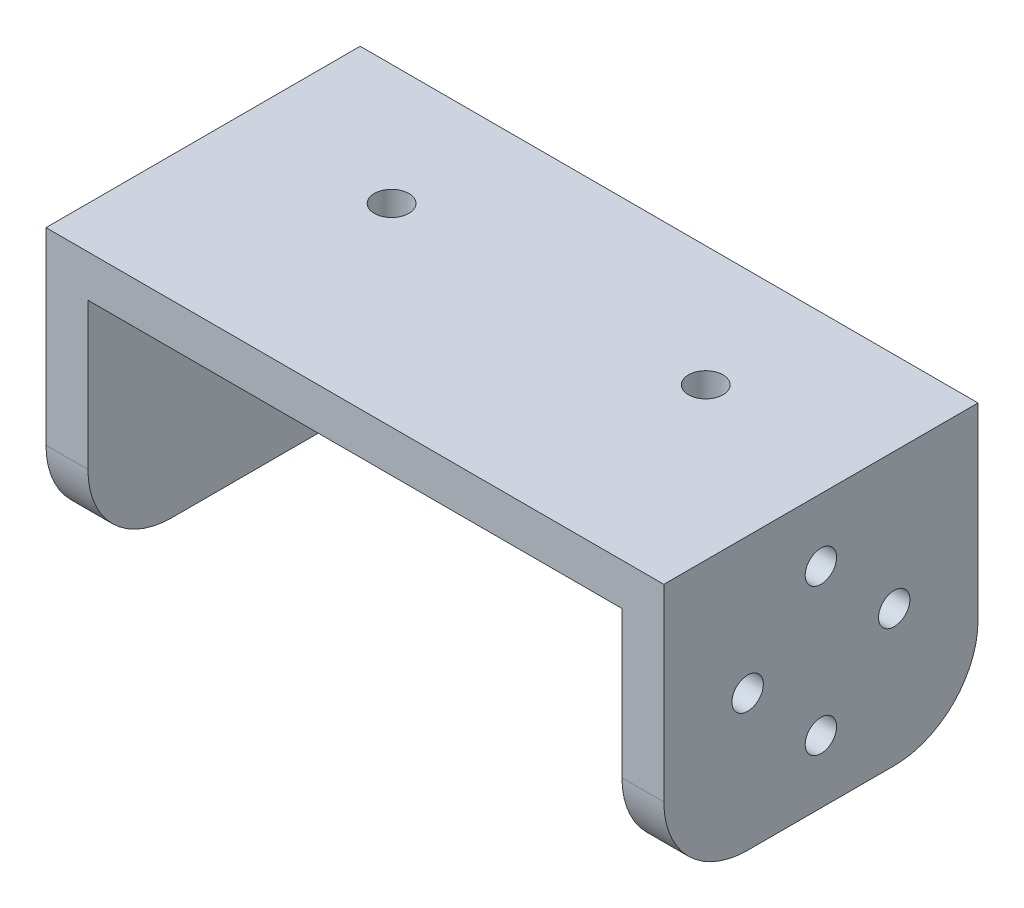
ISO-10303-21;
HEADER;
FILE_DESCRIPTION(('STEP AP214'),'2;1');
FILE_NAME('part.step','',(''),(''),'','','');
FILE_SCHEMA(('AUTOMOTIVE_DESIGN { 1 0 10303 214 1 1 1 1 }'));
ENDSEC;
DATA;
#1=APPLICATION_CONTEXT('core data for automotive mechanical design processes');
#2=APPLICATION_PROTOCOL_DEFINITION('international standard','automotive_design',2000,#1);
#3=PRODUCT_CONTEXT('',#1,'mechanical');
#4=PRODUCT('Part','Part','',(#3));
#5=PRODUCT_RELATED_PRODUCT_CATEGORY('part','',(#4));
#6=PRODUCT_DEFINITION_FORMATION('','',#4);
#7=PRODUCT_DEFINITION_CONTEXT('part definition',#1,'design');
#8=PRODUCT_DEFINITION('design','',#6,#7);
#9=PRODUCT_DEFINITION_SHAPE('','',#8);
#10=(LENGTH_UNIT() NAMED_UNIT(*) SI_UNIT(.MILLI.,.METRE.));
#11=(NAMED_UNIT(*) PLANE_ANGLE_UNIT() SI_UNIT($,.RADIAN.));
#12=(NAMED_UNIT(*) SI_UNIT($,.STERADIAN.) SOLID_ANGLE_UNIT());
#13=UNCERTAINTY_MEASURE_WITH_UNIT(LENGTH_MEASURE(1.E-05),#10,'distance_accuracy_value','');
#14=(GEOMETRIC_REPRESENTATION_CONTEXT(3) GLOBAL_UNCERTAINTY_ASSIGNED_CONTEXT((#13)) GLOBAL_UNIT_ASSIGNED_CONTEXT((#10,
#11,#12)) REPRESENTATION_CONTEXT('',''));
#15=CARTESIAN_POINT('',(0.,0.,0.));
#16=DIRECTION('',(0.,0.,1.));
#17=DIRECTION('',(1.,0.,0.));
#18=AXIS2_PLACEMENT_3D('',#15,#16,#17);
#19=CARTESIAN_POINT('',(29.5,0.,30.));
#20=DIRECTION('',(-1.,0.,0.));
#21=DIRECTION('',(0.,0.,1.));
#22=AXIS2_PLACEMENT_3D('',#19,#20,#21);
#23=PLANE('',#22);
#24=CARTESIAN_POINT('',(29.5,-13.,8.));
#25=DIRECTION('',(1.,0.,0.));
#26=DIRECTION('',(0.,0.,-1.));
#27=AXIS2_PLACEMENT_3D('',#24,#25,#26);
#28=CIRCLE('',#27,1.5);
#29=CARTESIAN_POINT('',(29.5,-13.,6.5));
#30=VERTEX_POINT('',#29);
#31=EDGE_CURVE('E206',#30,#30,#28,.T.);
#32=ORIENTED_EDGE('',*,*,#31,.F.);
#33=EDGE_LOOP('',(#32));
#34=FACE_BOUND('',#33,.T.);
#35=CARTESIAN_POINT('',(29.5,-20.,15.));
#36=DIRECTION('',(1.,0.,0.));
#37=DIRECTION('',(0.,0.,-1.));
#38=AXIS2_PLACEMENT_3D('',#35,#36,#37);
#39=CIRCLE('',#38,1.5);
#40=CARTESIAN_POINT('',(29.5,-20.,13.5));
#41=VERTEX_POINT('',#40);
#42=EDGE_CURVE('E469',#41,#41,#39,.T.);
#43=ORIENTED_EDGE('',*,*,#42,.F.);
#44=EDGE_LOOP('',(#43));
#45=FACE_BOUND('',#44,.T.);
#46=CARTESIAN_POINT('',(29.5,-13.,22.));
#47=DIRECTION('',(1.,0.,0.));
#48=DIRECTION('',(0.,0.,-1.));
#49=AXIS2_PLACEMENT_3D('',#46,#47,#48);
#50=CIRCLE('',#49,1.5);
#51=CARTESIAN_POINT('',(29.5,-13.,20.5));
#52=VERTEX_POINT('',#51);
#53=EDGE_CURVE('E472',#52,#52,#50,.T.);
#54=ORIENTED_EDGE('',*,*,#53,.F.);
#55=EDGE_LOOP('',(#54));
#56=FACE_BOUND('',#55,.T.);
#57=CARTESIAN_POINT('',(29.5,-6.,15.));
#58=DIRECTION('',(1.,0.,0.));
#59=DIRECTION('',(0.,0.,-1.));
#60=AXIS2_PLACEMENT_3D('',#57,#58,#59);
#61=CIRCLE('',#60,1.5);
#62=CARTESIAN_POINT('',(29.5,-6.,13.5));
#63=VERTEX_POINT('',#62);
#64=EDGE_CURVE('E221',#63,#63,#61,.T.);
#65=ORIENTED_EDGE('',*,*,#64,.F.);
#66=EDGE_LOOP('',(#65));
#67=FACE_BOUND('',#66,.T.);
#68=DIRECTION('',(0.,0.,-1.));
#69=VECTOR('',#68,1.);
#70=CARTESIAN_POINT('',(29.5,-26.,30.));
#71=LINE('',#70,#69);
#72=CARTESIAN_POINT('',(29.5,-26.,22.));
#73=VERTEX_POINT('',#72);
#74=CARTESIAN_POINT('',(29.5,-26.,8.));
#75=VERTEX_POINT('',#74);
#76=EDGE_CURVE('E234',#73,#75,#71,.T.);
#77=ORIENTED_EDGE('',*,*,#76,.T.);
#78=CARTESIAN_POINT('',(29.5,-18.,8.));
#79=DIRECTION('',(-1.,0.,0.));
#80=DIRECTION('',(0.,0.,1.));
#81=AXIS2_PLACEMENT_3D('',#78,#79,#80);
#82=CIRCLE('',#81,8.);
#83=CARTESIAN_POINT('',(29.5,-18.,0.));
#84=VERTEX_POINT('',#83);
#85=EDGE_CURVE('E187',#75,#84,#82,.F.);
#86=ORIENTED_EDGE('',*,*,#85,.T.);
#87=DIRECTION('',(0.,1.,0.));
#88=VECTOR('',#87,1.);
#89=CARTESIAN_POINT('',(29.5,0.,0.));
#90=LINE('',#89,#88);
#91=CARTESIAN_POINT('',(29.5,0.,0.));
#92=VERTEX_POINT('',#91);
#93=EDGE_CURVE('E153',#84,#92,#90,.T.);
#94=ORIENTED_EDGE('',*,*,#93,.T.);
#95=DIRECTION('',(0.,0.,-1.));
#96=VECTOR('',#95,1.);
#97=CARTESIAN_POINT('',(29.5,0.,30.));
#98=LINE('',#97,#96);
#99=CARTESIAN_POINT('',(29.5,0.,30.));
#100=VERTEX_POINT('',#99);
#101=EDGE_CURVE('E145',#100,#92,#98,.T.);
#102=ORIENTED_EDGE('',*,*,#101,.F.);
#103=DIRECTION('',(0.,1.,0.));
#104=VECTOR('',#103,1.);
#105=CARTESIAN_POINT('',(29.5,0.,30.));
#106=LINE('',#105,#104);
#107=CARTESIAN_POINT('',(29.5,-18.,30.));
#108=VERTEX_POINT('',#107);
#109=EDGE_CURVE('E129',#108,#100,#106,.T.);
#110=ORIENTED_EDGE('',*,*,#109,.F.);
#111=CARTESIAN_POINT('',(29.5,-18.,22.));
#112=DIRECTION('',(-1.,0.,0.));
#113=DIRECTION('',(0.,0.,1.));
#114=AXIS2_PLACEMENT_3D('',#111,#112,#113);
#115=CIRCLE('',#114,8.);
#116=EDGE_CURVE('E185',#108,#73,#115,.F.);
#117=ORIENTED_EDGE('',*,*,#116,.T.);
#118=EDGE_LOOP('',(#77,#86,#94,#102,#110,#117));
#119=FACE_BOUND('',#118,.T.);
#120=ADVANCED_FACE('F38',(#34,#45,#56,#67,#119),#23,.F.);
#121=CARTESIAN_POINT('',(0.,0.,30.));
#122=DIRECTION('',(0.,-1.,0.));
#123=DIRECTION('',(1.,0.,0.));
#124=AXIS2_PLACEMENT_3D('',#121,#122,#123);
#125=PLANE('',#124);
#126=CARTESIAN_POINT('',(15.,0.,11.5));
#127=DIRECTION('',(0.,1.,0.));
#128=DIRECTION('',(-1.,0.,0.));
#129=AXIS2_PLACEMENT_3D('',#126,#127,#128);
#130=CIRCLE('',#129,1.65000000000001);
#131=CARTESIAN_POINT('',(13.35,0.,11.5));
#132=VERTEX_POINT('',#131);
#133=EDGE_CURVE('E194',#132,#132,#130,.T.);
#134=ORIENTED_EDGE('',*,*,#133,.F.);
#135=EDGE_LOOP('',(#134));
#136=FACE_BOUND('',#135,.T.);
#137=CARTESIAN_POINT('',(-15.,0.,11.5));
#138=DIRECTION('',(0.,1.,0.));
#139=DIRECTION('',(-1.,0.,0.));
#140=AXIS2_PLACEMENT_3D('',#137,#138,#139);
#141=CIRCLE('',#140,1.65);
#142=CARTESIAN_POINT('',(-16.65,0.,11.5));
#143=VERTEX_POINT('',#142);
#144=EDGE_CURVE('E200',#143,#143,#141,.T.);
#145=ORIENTED_EDGE('',*,*,#144,.F.);
#146=EDGE_LOOP('',(#145));
#147=FACE_BOUND('',#146,.T.);
#148=DIRECTION('',(-1.,0.,0.));
#149=VECTOR('',#148,1.);
#150=CARTESIAN_POINT('',(0.,0.,0.));
#151=LINE('',#150,#149);
#152=CARTESIAN_POINT('',(-29.5,0.,0.));
#153=VERTEX_POINT('',#152);
#154=EDGE_CURVE('E236',#92,#153,#151,.T.);
#155=ORIENTED_EDGE('',*,*,#154,.T.);
#156=DIRECTION('',(0.,0.,-1.));
#157=VECTOR('',#156,1.);
#158=CARTESIAN_POINT('',(-29.5,0.,30.));
#159=LINE('',#158,#157);
#160=CARTESIAN_POINT('',(-29.5,0.,30.));
#161=VERTEX_POINT('',#160);
#162=EDGE_CURVE('E147',#161,#153,#159,.T.);
#163=ORIENTED_EDGE('',*,*,#162,.F.);
#164=DIRECTION('',(-1.,0.,0.));
#165=VECTOR('',#164,1.);
#166=CARTESIAN_POINT('',(0.,0.,30.));
#167=LINE('',#166,#165);
#168=EDGE_CURVE('E133',#100,#161,#167,.T.);
#169=ORIENTED_EDGE('',*,*,#168,.F.);
#170=ORIENTED_EDGE('',*,*,#101,.T.);
#171=EDGE_LOOP('',(#155,#163,#169,#170));
#172=FACE_BOUND('',#171,.T.);
#173=ADVANCED_FACE('F144',(#136,#147,#172),#125,.F.);
#174=CARTESIAN_POINT('',(-29.5,0.,30.));
#175=DIRECTION('',(1.,0.,0.));
#176=DIRECTION('',(0.,1.,0.));
#177=AXIS2_PLACEMENT_3D('',#174,#175,#176);
#178=PLANE('',#177);
#179=CARTESIAN_POINT('',(-29.5,-13.,15.));
#180=DIRECTION('',(-1.,0.,0.));
#181=DIRECTION('',(0.,-1.,0.));
#182=AXIS2_PLACEMENT_3D('',#179,#180,#181);
#183=CIRCLE('',#182,1.65);
#184=CARTESIAN_POINT('',(-29.5,-14.65,15.));
#185=VERTEX_POINT('',#184);
#186=EDGE_CURVE('E201',#185,#185,#183,.T.);
#187=ORIENTED_EDGE('',*,*,#186,.F.);
#188=EDGE_LOOP('',(#187));
#189=FACE_BOUND('',#188,.T.);
#190=DIRECTION('',(0.,0.,-1.));
#191=VECTOR('',#190,1.);
#192=CARTESIAN_POINT('',(-29.5,-26.,30.));
#193=LINE('',#192,#191);
#194=CARTESIAN_POINT('',(-29.5,-26.,22.));
#195=VERTEX_POINT('',#194);
#196=CARTESIAN_POINT('',(-29.5,-26.,8.));
#197=VERTEX_POINT('',#196);
#198=EDGE_CURVE('E158',#195,#197,#193,.T.);
#199=ORIENTED_EDGE('',*,*,#198,.F.);
#200=CARTESIAN_POINT('',(-29.5,-18.,22.));
#201=DIRECTION('',(1.,0.,0.));
#202=DIRECTION('',(0.,1.,0.));
#203=AXIS2_PLACEMENT_3D('',#200,#201,#202);
#204=CIRCLE('',#203,8.);
#205=CARTESIAN_POINT('',(-29.5,-18.,30.));
#206=VERTEX_POINT('',#205);
#207=EDGE_CURVE('E175',#195,#206,#204,.F.);
#208=ORIENTED_EDGE('',*,*,#207,.T.);
#209=DIRECTION('',(0.,-1.,0.));
#210=VECTOR('',#209,1.);
#211=CARTESIAN_POINT('',(-29.5,0.,30.));
#212=LINE('',#211,#210);
#213=EDGE_CURVE('E149',#161,#206,#212,.T.);
#214=ORIENTED_EDGE('',*,*,#213,.F.);
#215=ORIENTED_EDGE('',*,*,#162,.T.);
#216=DIRECTION('',(0.,-1.,0.));
#217=VECTOR('',#216,1.);
#218=CARTESIAN_POINT('',(-29.5,0.,0.));
#219=LINE('',#218,#217);
#220=CARTESIAN_POINT('',(-29.5,-18.,0.));
#221=VERTEX_POINT('',#220);
#222=EDGE_CURVE('E238',#153,#221,#219,.T.);
#223=ORIENTED_EDGE('',*,*,#222,.T.);
#224=CARTESIAN_POINT('',(-29.5,-18.,8.));
#225=DIRECTION('',(1.,0.,0.));
#226=DIRECTION('',(0.,1.,0.));
#227=AXIS2_PLACEMENT_3D('',#224,#225,#226);
#228=CIRCLE('',#227,8.);
#229=EDGE_CURVE('E173',#221,#197,#228,.F.);
#230=ORIENTED_EDGE('',*,*,#229,.T.);
#231=EDGE_LOOP('',(#199,#208,#214,#215,#223,#230));
#232=FACE_BOUND('',#231,.T.);
#233=ADVANCED_FACE('F287',(#189,#232),#178,.F.);
#234=CARTESIAN_POINT('',(-25.5,-26.,30.));
#235=DIRECTION('',(0.,1.,0.));
#236=DIRECTION('',(0.,0.,1.));
#237=AXIS2_PLACEMENT_3D('',#234,#235,#236);
#238=PLANE('',#237);
#239=DIRECTION('',(0.,0.,-1.));
#240=VECTOR('',#239,1.);
#241=CARTESIAN_POINT('',(-25.5,-26.,30.));
#242=LINE('',#241,#240);
#243=CARTESIAN_POINT('',(-25.5,-26.,22.));
#244=VERTEX_POINT('',#243);
#245=CARTESIAN_POINT('',(-25.5,-26.,8.));
#246=VERTEX_POINT('',#245);
#247=EDGE_CURVE('E255',#244,#246,#242,.T.);
#248=ORIENTED_EDGE('',*,*,#247,.F.);
#249=DIRECTION('',(1.,0.,0.));
#250=VECTOR('',#249,1.);
#251=CARTESIAN_POINT('',(-29.5,-26.,22.));
#252=LINE('',#251,#250);
#253=EDGE_CURVE('E171',#244,#195,#252,.F.);
#254=ORIENTED_EDGE('',*,*,#253,.T.);
#255=ORIENTED_EDGE('',*,*,#198,.T.);
#256=DIRECTION('',(1.,0.,0.));
#257=VECTOR('',#256,1.);
#258=CARTESIAN_POINT('',(-25.5,-26.,8.));
#259=LINE('',#258,#257);
#260=EDGE_CURVE('E168',#197,#246,#259,.T.);
#261=ORIENTED_EDGE('',*,*,#260,.T.);
#262=EDGE_LOOP('',(#248,#254,#255,#261));
#263=FACE_BOUND('',#262,.T.);
#264=ADVANCED_FACE('F262',(#263),#238,.F.);
#265=CARTESIAN_POINT('',(-25.5,-4.00000000000001,30.));
#266=DIRECTION('',(-1.,0.,0.));
#267=DIRECTION('',(0.,0.,1.));
#268=AXIS2_PLACEMENT_3D('',#265,#266,#267);
#269=PLANE('',#268);
#270=CARTESIAN_POINT('',(-25.5,-13.,15.));
#271=DIRECTION('',(-1.,0.,0.));
#272=DIRECTION('',(0.,0.,1.));
#273=AXIS2_PLACEMENT_3D('',#270,#271,#272);
#274=CIRCLE('',#273,1.65);
#275=CARTESIAN_POINT('',(-25.5,-13.,16.65));
#276=VERTEX_POINT('',#275);
#277=EDGE_CURVE('E197',#276,#276,#274,.T.);
#278=ORIENTED_EDGE('',*,*,#277,.T.);
#279=EDGE_LOOP('',(#278));
#280=FACE_BOUND('',#279,.T.);
#281=DIRECTION('',(0.,1.,0.));
#282=VECTOR('',#281,1.);
#283=CARTESIAN_POINT('',(-25.5,-4.00000000000001,30.));
#284=LINE('',#283,#282);
#285=CARTESIAN_POINT('',(-25.5,-18.,30.));
#286=VERTEX_POINT('',#285);
#287=CARTESIAN_POINT('',(-25.5,-4.00000000000001,30.));
#288=VERTEX_POINT('',#287);
#289=EDGE_CURVE('E228',#286,#288,#284,.T.);
#290=ORIENTED_EDGE('',*,*,#289,.F.);
#291=CARTESIAN_POINT('',(-25.5,-18.,22.));
#292=DIRECTION('',(-1.,0.,0.));
#293=DIRECTION('',(0.,0.,1.));
#294=AXIS2_PLACEMENT_3D('',#291,#292,#293);
#295=CIRCLE('',#294,8.);
#296=EDGE_CURVE('E166',#286,#244,#295,.F.);
#297=ORIENTED_EDGE('',*,*,#296,.T.);
#298=ORIENTED_EDGE('',*,*,#247,.T.);
#299=CARTESIAN_POINT('',(-25.5,-18.,8.));
#300=DIRECTION('',(-1.,0.,0.));
#301=DIRECTION('',(0.,0.,1.));
#302=AXIS2_PLACEMENT_3D('',#299,#300,#301);
#303=CIRCLE('',#302,8.);
#304=CARTESIAN_POINT('',(-25.5,-18.,0.));
#305=VERTEX_POINT('',#304);
#306=EDGE_CURVE('E164',#246,#305,#303,.F.);
#307=ORIENTED_EDGE('',*,*,#306,.T.);
#308=DIRECTION('',(0.,1.,0.));
#309=VECTOR('',#308,1.);
#310=CARTESIAN_POINT('',(-25.5,-4.00000000000001,0.));
#311=LINE('',#310,#309);
#312=CARTESIAN_POINT('',(-25.5,-4.00000000000001,0.));
#313=VERTEX_POINT('',#312);
#314=EDGE_CURVE('E241',#305,#313,#311,.T.);
#315=ORIENTED_EDGE('',*,*,#314,.T.);
#316=DIRECTION('',(0.,0.,-1.));
#317=VECTOR('',#316,1.);
#318=CARTESIAN_POINT('',(-25.5,-4.00000000000001,30.));
#319=LINE('',#318,#317);
#320=EDGE_CURVE('E252',#288,#313,#319,.T.);
#321=ORIENTED_EDGE('',*,*,#320,.F.);
#322=EDGE_LOOP('',(#290,#297,#298,#307,#315,#321));
#323=FACE_BOUND('',#322,.T.);
#324=ADVANCED_FACE('F273',(#280,#323),#269,.F.);
#325=CARTESIAN_POINT('',(0.,-4.,30.));
#326=DIRECTION('',(0.,1.,0.));
#327=DIRECTION('',(0.,0.,1.));
#328=AXIS2_PLACEMENT_3D('',#325,#326,#327);
#329=PLANE('',#328);
#330=CARTESIAN_POINT('',(15.,-4.,11.5));
#331=DIRECTION('',(0.,1.,0.));
#332=DIRECTION('',(0.,0.,1.));
#333=AXIS2_PLACEMENT_3D('',#330,#331,#332);
#334=CIRCLE('',#333,1.65000000000001);
#335=CARTESIAN_POINT('',(15.,-4.,13.15));
#336=VERTEX_POINT('',#335);
#337=EDGE_CURVE('E193',#336,#336,#334,.T.);
#338=ORIENTED_EDGE('',*,*,#337,.T.);
#339=EDGE_LOOP('',(#338));
#340=FACE_BOUND('',#339,.T.);
#341=CARTESIAN_POINT('',(-15.,-4.,11.5));
#342=DIRECTION('',(0.,1.,0.));
#343=DIRECTION('',(0.,0.,1.));
#344=AXIS2_PLACEMENT_3D('',#341,#342,#343);
#345=CIRCLE('',#344,1.65);
#346=CARTESIAN_POINT('',(-15.,-4.,13.15));
#347=VERTEX_POINT('',#346);
#348=EDGE_CURVE('E190',#347,#347,#345,.T.);
#349=ORIENTED_EDGE('',*,*,#348,.T.);
#350=EDGE_LOOP('',(#349));
#351=FACE_BOUND('',#350,.T.);
#352=DIRECTION('',(1.,0.,0.));
#353=VECTOR('',#352,1.);
#354=CARTESIAN_POINT('',(0.,-4.,0.));
#355=LINE('',#354,#353);
#356=CARTESIAN_POINT('',(25.5,-4.,0.));
#357=VERTEX_POINT('',#356);
#358=EDGE_CURVE('E243',#313,#357,#355,.T.);
#359=ORIENTED_EDGE('',*,*,#358,.T.);
#360=DIRECTION('',(0.,0.,-1.));
#361=VECTOR('',#360,1.);
#362=CARTESIAN_POINT('',(25.5,-4.,30.));
#363=LINE('',#362,#361);
#364=CARTESIAN_POINT('',(25.5,-4.,30.));
#365=VERTEX_POINT('',#364);
#366=EDGE_CURVE('E249',#365,#357,#363,.T.);
#367=ORIENTED_EDGE('',*,*,#366,.F.);
#368=DIRECTION('',(1.,0.,0.));
#369=VECTOR('',#368,1.);
#370=CARTESIAN_POINT('',(0.,-4.,30.));
#371=LINE('',#370,#369);
#372=EDGE_CURVE('E230',#288,#365,#371,.T.);
#373=ORIENTED_EDGE('',*,*,#372,.F.);
#374=ORIENTED_EDGE('',*,*,#320,.T.);
#375=EDGE_LOOP('',(#359,#367,#373,#374));
#376=FACE_BOUND('',#375,.T.);
#377=ADVANCED_FACE('F283',(#340,#351,#376),#329,.F.);
#378=CARTESIAN_POINT('',(25.5,-4.,30.));
#379=DIRECTION('',(1.,0.,0.));
#380=DIRECTION('',(0.,1.,0.));
#381=AXIS2_PLACEMENT_3D('',#378,#379,#380);
#382=PLANE('',#381);
#383=CARTESIAN_POINT('',(25.5,-13.,8.));
#384=DIRECTION('',(1.,0.,0.));
#385=DIRECTION('',(0.,1.,0.));
#386=AXIS2_PLACEMENT_3D('',#383,#384,#385);
#387=CIRCLE('',#386,1.5);
#388=CARTESIAN_POINT('',(25.5,-11.5,8.));
#389=VERTEX_POINT('',#388);
#390=EDGE_CURVE('E42',#389,#389,#387,.T.);
#391=ORIENTED_EDGE('',*,*,#390,.T.);
#392=EDGE_LOOP('',(#391));
#393=FACE_BOUND('',#392,.T.);
#394=CARTESIAN_POINT('',(25.5,-20.,15.));
#395=DIRECTION('',(1.,0.,0.));
#396=DIRECTION('',(0.,1.,0.));
#397=AXIS2_PLACEMENT_3D('',#394,#395,#396);
#398=CIRCLE('',#397,1.5);
#399=CARTESIAN_POINT('',(25.5,-18.5,15.));
#400=VERTEX_POINT('',#399);
#401=EDGE_CURVE('E208',#400,#400,#398,.T.);
#402=ORIENTED_EDGE('',*,*,#401,.T.);
#403=EDGE_LOOP('',(#402));
#404=FACE_BOUND('',#403,.T.);
#405=CARTESIAN_POINT('',(25.5,-13.,22.));
#406=DIRECTION('',(1.,0.,0.));
#407=DIRECTION('',(0.,1.,0.));
#408=AXIS2_PLACEMENT_3D('',#405,#406,#407);
#409=CIRCLE('',#408,1.5);
#410=CARTESIAN_POINT('',(25.5,-11.5,22.));
#411=VERTEX_POINT('',#410);
#412=EDGE_CURVE('E205',#411,#411,#409,.T.);
#413=ORIENTED_EDGE('',*,*,#412,.T.);
#414=EDGE_LOOP('',(#413));
#415=FACE_BOUND('',#414,.T.);
#416=CARTESIAN_POINT('',(25.5,-6.,15.));
#417=DIRECTION('',(1.,0.,0.));
#418=DIRECTION('',(0.,1.,0.));
#419=AXIS2_PLACEMENT_3D('',#416,#417,#418);
#420=CIRCLE('',#419,1.5);
#421=CARTESIAN_POINT('',(25.5,-4.5,15.));
#422=VERTEX_POINT('',#421);
#423=EDGE_CURVE('E202',#422,#422,#420,.T.);
#424=ORIENTED_EDGE('',*,*,#423,.T.);
#425=EDGE_LOOP('',(#424));
#426=FACE_BOUND('',#425,.T.);
#427=DIRECTION('',(0.,-1.,0.));
#428=VECTOR('',#427,1.);
#429=CARTESIAN_POINT('',(25.5,-4.,0.));
#430=LINE('',#429,#428);
#431=CARTESIAN_POINT('',(25.5,-18.,0.));
#432=VERTEX_POINT('',#431);
#433=EDGE_CURVE('E140',#357,#432,#430,.T.);
#434=ORIENTED_EDGE('',*,*,#433,.T.);
#435=CARTESIAN_POINT('',(25.5,-18.,8.));
#436=DIRECTION('',(1.,0.,0.));
#437=DIRECTION('',(0.,1.,0.));
#438=AXIS2_PLACEMENT_3D('',#435,#436,#437);
#439=CIRCLE('',#438,8.);
#440=CARTESIAN_POINT('',(25.5,-26.,8.));
#441=VERTEX_POINT('',#440);
#442=EDGE_CURVE('E11',#432,#441,#439,.F.);
#443=ORIENTED_EDGE('',*,*,#442,.T.);
#444=DIRECTION('',(0.,0.,-1.));
#445=VECTOR('',#444,1.);
#446=CARTESIAN_POINT('',(25.5,-26.,30.));
#447=LINE('',#446,#445);
#448=CARTESIAN_POINT('',(25.5,-26.,22.));
#449=VERTEX_POINT('',#448);
#450=EDGE_CURVE('E247',#449,#441,#447,.T.);
#451=ORIENTED_EDGE('',*,*,#450,.F.);
#452=CARTESIAN_POINT('',(25.5,-18.,22.));
#453=DIRECTION('',(1.,0.,0.));
#454=DIRECTION('',(0.,1.,0.));
#455=AXIS2_PLACEMENT_3D('',#452,#453,#454);
#456=CIRCLE('',#455,8.);
#457=CARTESIAN_POINT('',(25.5,-18.,30.));
#458=VERTEX_POINT('',#457);
#459=EDGE_CURVE('E47',#449,#458,#456,.F.);
#460=ORIENTED_EDGE('',*,*,#459,.T.);
#461=DIRECTION('',(0.,-1.,0.));
#462=VECTOR('',#461,1.);
#463=CARTESIAN_POINT('',(25.5,-4.,30.));
#464=LINE('',#463,#462);
#465=EDGE_CURVE('E232',#365,#458,#464,.T.);
#466=ORIENTED_EDGE('',*,*,#465,.F.);
#467=ORIENTED_EDGE('',*,*,#366,.T.);
#468=EDGE_LOOP('',(#434,#443,#451,#460,#466,#467));
#469=FACE_BOUND('',#468,.T.);
#470=ADVANCED_FACE('F296',(#393,#404,#415,#426,#469),#382,.F.);
#471=CARTESIAN_POINT('',(25.5,-26.,30.));
#472=DIRECTION('',(0.,1.,0.));
#473=DIRECTION('',(0.,0.,1.));
#474=AXIS2_PLACEMENT_3D('',#471,#472,#473);
#475=PLANE('',#474);
#476=ORIENTED_EDGE('',*,*,#450,.T.);
#477=DIRECTION('',(1.,0.,0.));
#478=VECTOR('',#477,1.);
#479=CARTESIAN_POINT('',(25.5,-26.,8.));
#480=LINE('',#479,#478);
#481=EDGE_CURVE('E182',#441,#75,#480,.T.);
#482=ORIENTED_EDGE('',*,*,#481,.T.);
#483=ORIENTED_EDGE('',*,*,#76,.F.);
#484=DIRECTION('',(1.,0.,0.));
#485=VECTOR('',#484,1.);
#486=CARTESIAN_POINT('',(25.5,-26.,22.));
#487=LINE('',#486,#485);
#488=EDGE_CURVE('E60',#73,#449,#487,.F.);
#489=ORIENTED_EDGE('',*,*,#488,.T.);
#490=EDGE_LOOP('',(#476,#482,#483,#489));
#491=FACE_BOUND('',#490,.T.);
#492=ADVANCED_FACE('F292',(#491),#475,.F.);
#493=CARTESIAN_POINT('',(0.,0.,30.));
#494=DIRECTION('',(0.,0.,1.));
#495=DIRECTION('',(1.,0.,0.));
#496=AXIS2_PLACEMENT_3D('',#493,#494,#495);
#497=PLANE('',#496);
#498=ORIENTED_EDGE('',*,*,#213,.T.);
#499=DIRECTION('',(1.,0.,0.));
#500=VECTOR('',#499,1.);
#501=CARTESIAN_POINT('',(-25.5,-18.,30.));
#502=LINE('',#501,#500);
#503=EDGE_CURVE('E156',#206,#286,#502,.T.);
#504=ORIENTED_EDGE('',*,*,#503,.T.);
#505=ORIENTED_EDGE('',*,*,#289,.T.);
#506=ORIENTED_EDGE('',*,*,#372,.T.);
#507=ORIENTED_EDGE('',*,*,#465,.T.);
#508=DIRECTION('',(1.,0.,0.));
#509=VECTOR('',#508,1.);
#510=CARTESIAN_POINT('',(29.5,-18.,30.));
#511=LINE('',#510,#509);
#512=EDGE_CURVE('E137',#458,#108,#511,.T.);
#513=ORIENTED_EDGE('',*,*,#512,.T.);
#514=ORIENTED_EDGE('',*,*,#109,.T.);
#515=ORIENTED_EDGE('',*,*,#168,.T.);
#516=EDGE_LOOP('',(#498,#504,#505,#506,#507,#513,#514,#515));
#517=FACE_BOUND('',#516,.T.);
#518=ADVANCED_FACE('F132',(#517),#497,.T.);
#519=CARTESIAN_POINT('',(0.,0.,0.));
#520=DIRECTION('',(0.,0.,1.));
#521=DIRECTION('',(1.,0.,0.));
#522=AXIS2_PLACEMENT_3D('',#519,#520,#521);
#523=PLANE('',#522);
#524=ORIENTED_EDGE('',*,*,#314,.F.);
#525=DIRECTION('',(1.,0.,0.));
#526=VECTOR('',#525,1.);
#527=CARTESIAN_POINT('',(0.,-18.,0.));
#528=LINE('',#527,#526);
#529=EDGE_CURVE('E179',#305,#221,#528,.F.);
#530=ORIENTED_EDGE('',*,*,#529,.T.);
#531=ORIENTED_EDGE('',*,*,#222,.F.);
#532=ORIENTED_EDGE('',*,*,#154,.F.);
#533=ORIENTED_EDGE('',*,*,#93,.F.);
#534=DIRECTION('',(1.,0.,0.));
#535=VECTOR('',#534,1.);
#536=CARTESIAN_POINT('',(0.,-18.,0.));
#537=LINE('',#536,#535);
#538=EDGE_CURVE('E177',#84,#432,#537,.F.);
#539=ORIENTED_EDGE('',*,*,#538,.T.);
#540=ORIENTED_EDGE('',*,*,#433,.F.);
#541=ORIENTED_EDGE('',*,*,#358,.F.);
#542=EDGE_LOOP('',(#524,#530,#531,#532,#533,#539,#540,#541));
#543=FACE_BOUND('',#542,.T.);
#544=ADVANCED_FACE('F277',(#543),#523,.F.);
#545=CARTESIAN_POINT('',(0.,-18.,22.));
#546=DIRECTION('',(-1.,0.,0.));
#547=DIRECTION('',(0.,0.,1.));
#548=AXIS2_PLACEMENT_3D('',#545,#546,#547);
#549=CYLINDRICAL_SURFACE('',#548,8.);
#550=ORIENTED_EDGE('',*,*,#207,.F.);
#551=ORIENTED_EDGE('',*,*,#253,.F.);
#552=ORIENTED_EDGE('',*,*,#296,.F.);
#553=ORIENTED_EDGE('',*,*,#503,.F.);
#554=EDGE_LOOP('',(#550,#551,#552,#553));
#555=FACE_BOUND('',#554,.T.);
#556=ADVANCED_FACE('F286',(#555),#549,.T.);
#557=CARTESIAN_POINT('',(-25.5,-18.,8.));
#558=DIRECTION('',(1.,0.,0.));
#559=DIRECTION('',(0.,0.,-1.));
#560=AXIS2_PLACEMENT_3D('',#557,#558,#559);
#561=CYLINDRICAL_SURFACE('',#560,8.);
#562=ORIENTED_EDGE('',*,*,#229,.F.);
#563=ORIENTED_EDGE('',*,*,#529,.F.);
#564=ORIENTED_EDGE('',*,*,#306,.F.);
#565=ORIENTED_EDGE('',*,*,#260,.F.);
#566=EDGE_LOOP('',(#562,#563,#564,#565));
#567=FACE_BOUND('',#566,.T.);
#568=ADVANCED_FACE('F268',(#567),#561,.T.);
#569=CARTESIAN_POINT('',(25.5,-18.,8.));
#570=DIRECTION('',(1.,0.,0.));
#571=DIRECTION('',(0.,0.,-1.));
#572=AXIS2_PLACEMENT_3D('',#569,#570,#571);
#573=CYLINDRICAL_SURFACE('',#572,8.);
#574=ORIENTED_EDGE('',*,*,#442,.F.);
#575=ORIENTED_EDGE('',*,*,#538,.F.);
#576=ORIENTED_EDGE('',*,*,#85,.F.);
#577=ORIENTED_EDGE('',*,*,#481,.F.);
#578=EDGE_LOOP('',(#574,#575,#576,#577));
#579=FACE_BOUND('',#578,.T.);
#580=ADVANCED_FACE('F290',(#579),#573,.T.);
#581=CARTESIAN_POINT('',(0.,-18.,22.));
#582=DIRECTION('',(-1.,0.,0.));
#583=DIRECTION('',(0.,0.,1.));
#584=AXIS2_PLACEMENT_3D('',#581,#582,#583);
#585=CYLINDRICAL_SURFACE('',#584,8.);
#586=ORIENTED_EDGE('',*,*,#459,.F.);
#587=ORIENTED_EDGE('',*,*,#488,.F.);
#588=ORIENTED_EDGE('',*,*,#116,.F.);
#589=ORIENTED_EDGE('',*,*,#512,.F.);
#590=EDGE_LOOP('',(#586,#587,#588,#589));
#591=FACE_BOUND('',#590,.T.);
#592=ADVANCED_FACE('F40',(#591),#585,.T.);
#593=CARTESIAN_POINT('',(-15.,-10.,11.5));
#594=DIRECTION('',(0.,1.,0.));
#595=DIRECTION('',(-1.,0.,0.));
#596=AXIS2_PLACEMENT_3D('',#593,#594,#595);
#597=CYLINDRICAL_SURFACE('',#596,1.65);
#598=ORIENTED_EDGE('',*,*,#144,.T.);
#599=EDGE_LOOP('',(#598));
#600=FACE_BOUND('',#599,.T.);
#601=ORIENTED_EDGE('',*,*,#348,.F.);
#602=EDGE_LOOP('',(#601));
#603=FACE_BOUND('',#602,.T.);
#604=ADVANCED_FACE('F325',(#600,#603),#597,.F.);
#605=CARTESIAN_POINT('',(15.,-10.,11.5));
#606=DIRECTION('',(0.,1.,0.));
#607=DIRECTION('',(-1.,0.,0.));
#608=AXIS2_PLACEMENT_3D('',#605,#606,#607);
#609=CYLINDRICAL_SURFACE('',#608,1.65000000000001);
#610=ORIENTED_EDGE('',*,*,#133,.T.);
#611=EDGE_LOOP('',(#610));
#612=FACE_BOUND('',#611,.T.);
#613=ORIENTED_EDGE('',*,*,#337,.F.);
#614=EDGE_LOOP('',(#613));
#615=FACE_BOUND('',#614,.T.);
#616=ADVANCED_FACE('F329',(#612,#615),#609,.F.);
#617=CARTESIAN_POINT('',(-19.5,-13.,15.));
#618=DIRECTION('',(-1.,0.,0.));
#619=DIRECTION('',(0.,-1.,0.));
#620=AXIS2_PLACEMENT_3D('',#617,#618,#619);
#621=CYLINDRICAL_SURFACE('',#620,1.65);
#622=ORIENTED_EDGE('',*,*,#186,.T.);
#623=EDGE_LOOP('',(#622));
#624=FACE_BOUND('',#623,.T.);
#625=ORIENTED_EDGE('',*,*,#277,.F.);
#626=EDGE_LOOP('',(#625));
#627=FACE_BOUND('',#626,.T.);
#628=ADVANCED_FACE('F335',(#624,#627),#621,.F.);
#629=CARTESIAN_POINT('',(19.5,-6.,15.));
#630=DIRECTION('',(1.,0.,0.));
#631=DIRECTION('',(0.,0.,-1.));
#632=AXIS2_PLACEMENT_3D('',#629,#630,#631);
#633=CYLINDRICAL_SURFACE('',#632,1.5);
#634=ORIENTED_EDGE('',*,*,#64,.T.);
#635=EDGE_LOOP('',(#634));
#636=FACE_BOUND('',#635,.T.);
#637=ORIENTED_EDGE('',*,*,#423,.F.);
#638=EDGE_LOOP('',(#637));
#639=FACE_BOUND('',#638,.T.);
#640=ADVANCED_FACE('F416',(#636,#639),#633,.F.);
#641=CARTESIAN_POINT('',(19.5,-13.,22.));
#642=DIRECTION('',(1.,0.,0.));
#643=DIRECTION('',(0.,0.,-1.));
#644=AXIS2_PLACEMENT_3D('',#641,#642,#643);
#645=CYLINDRICAL_SURFACE('',#644,1.5);
#646=ORIENTED_EDGE('',*,*,#53,.T.);
#647=EDGE_LOOP('',(#646));
#648=FACE_BOUND('',#647,.T.);
#649=ORIENTED_EDGE('',*,*,#412,.F.);
#650=EDGE_LOOP('',(#649));
#651=FACE_BOUND('',#650,.T.);
#652=ADVANCED_FACE('F433',(#648,#651),#645,.F.);
#653=CARTESIAN_POINT('',(19.5,-20.,15.));
#654=DIRECTION('',(1.,0.,0.));
#655=DIRECTION('',(0.,0.,-1.));
#656=AXIS2_PLACEMENT_3D('',#653,#654,#655);
#657=CYLINDRICAL_SURFACE('',#656,1.5);
#658=ORIENTED_EDGE('',*,*,#42,.T.);
#659=EDGE_LOOP('',(#658));
#660=FACE_BOUND('',#659,.T.);
#661=ORIENTED_EDGE('',*,*,#401,.F.);
#662=EDGE_LOOP('',(#661));
#663=FACE_BOUND('',#662,.T.);
#664=ADVANCED_FACE('F443',(#660,#663),#657,.F.);
#665=CARTESIAN_POINT('',(19.5,-13.,8.));
#666=DIRECTION('',(1.,0.,0.));
#667=DIRECTION('',(0.,0.,-1.));
#668=AXIS2_PLACEMENT_3D('',#665,#666,#667);
#669=CYLINDRICAL_SURFACE('',#668,1.5);
#670=ORIENTED_EDGE('',*,*,#31,.T.);
#671=EDGE_LOOP('',(#670));
#672=FACE_BOUND('',#671,.T.);
#673=ORIENTED_EDGE('',*,*,#390,.F.);
#674=EDGE_LOOP('',(#673));
#675=FACE_BOUND('',#674,.T.);
#676=ADVANCED_FACE('F453',(#672,#675),#669,.F.);
#677=CLOSED_SHELL('',(#120,#173,#233,#264,#324,#377,#470,#492,#518,#544,#556,#568,#580,#592,
#604,#616,#628,#640,#652,#664,#676));
#678=MANIFOLD_SOLID_BREP('B2',#677);
#679=ADVANCED_BREP_SHAPE_REPRESENTATION('',(#18,#678),#14);
#680=SHAPE_DEFINITION_REPRESENTATION(#9,#679);
ENDSEC;
END-ISO-10303-21;
